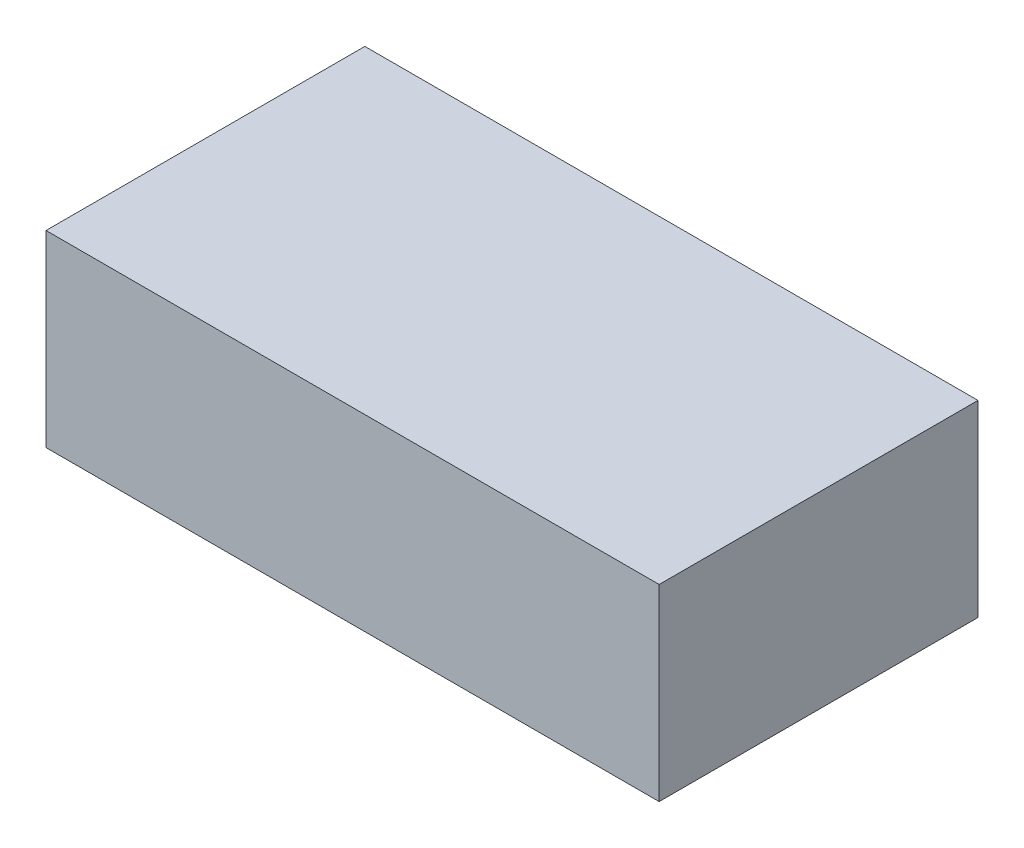
ISO-10303-21;
HEADER;
FILE_DESCRIPTION(('STEP AP214'),'2;1');
FILE_NAME('part.step','',(''),(''),'','','');
FILE_SCHEMA(('AUTOMOTIVE_DESIGN { 1 0 10303 214 1 1 1 1 }'));
ENDSEC;
DATA;
#1=APPLICATION_CONTEXT('core data for automotive mechanical design processes');
#2=APPLICATION_PROTOCOL_DEFINITION('international standard','automotive_design',2000,#1);
#3=PRODUCT_CONTEXT('',#1,'mechanical');
#4=PRODUCT('Part','Part','',(#3));
#5=PRODUCT_RELATED_PRODUCT_CATEGORY('part','',(#4));
#6=PRODUCT_DEFINITION_FORMATION('','',#4);
#7=PRODUCT_DEFINITION_CONTEXT('part definition',#1,'design');
#8=PRODUCT_DEFINITION('design','',#6,#7);
#9=PRODUCT_DEFINITION_SHAPE('','',#8);
#10=(LENGTH_UNIT() NAMED_UNIT(*) SI_UNIT(.MILLI.,.METRE.));
#11=(NAMED_UNIT(*) PLANE_ANGLE_UNIT() SI_UNIT($,.RADIAN.));
#12=(NAMED_UNIT(*) SI_UNIT($,.STERADIAN.) SOLID_ANGLE_UNIT());
#13=UNCERTAINTY_MEASURE_WITH_UNIT(LENGTH_MEASURE(1.E-05),#10,'distance_accuracy_value','');
#14=(GEOMETRIC_REPRESENTATION_CONTEXT(3) GLOBAL_UNCERTAINTY_ASSIGNED_CONTEXT((#13)) GLOBAL_UNIT_ASSIGNED_CONTEXT((#10,
#11,#12)) REPRESENTATION_CONTEXT('',''));
#15=CARTESIAN_POINT('',(0.,0.,0.));
#16=DIRECTION('',(0.,0.,1.));
#17=DIRECTION('',(1.,0.,0.));
#18=AXIS2_PLACEMENT_3D('',#15,#16,#17);
#19=CARTESIAN_POINT('',(0.,0.,39.));
#20=DIRECTION('',(1.,0.,0.));
#21=DIRECTION('',(0.,0.,-1.));
#22=AXIS2_PLACEMENT_3D('',#19,#20,#21);
#23=PLANE('',#22);
#24=DIRECTION('',(0.,-1.,0.));
#25=VECTOR('',#24,1.);
#26=CARTESIAN_POINT('',(0.,0.,0.));
#27=LINE('',#26,#25);
#28=CARTESIAN_POINT('',(0.,23.,0.));
#29=VERTEX_POINT('',#28);
#30=CARTESIAN_POINT('',(0.,0.,0.));
#31=VERTEX_POINT('',#30);
#32=EDGE_CURVE('E108',#29,#31,#27,.T.);
#33=ORIENTED_EDGE('',*,*,#32,.T.);
#34=DIRECTION('',(0.,0.,-1.));
#35=VECTOR('',#34,1.);
#36=CARTESIAN_POINT('',(0.,0.,39.));
#37=LINE('',#36,#35);
#38=CARTESIAN_POINT('',(0.,0.,39.));
#39=VERTEX_POINT('',#38);
#40=EDGE_CURVE('E11',#39,#31,#37,.T.);
#41=ORIENTED_EDGE('',*,*,#40,.F.);
#42=DIRECTION('',(0.,-1.,0.));
#43=VECTOR('',#42,1.);
#44=CARTESIAN_POINT('',(0.,0.,39.));
#45=LINE('',#44,#43);
#46=CARTESIAN_POINT('',(0.,23.,39.));
#47=VERTEX_POINT('',#46);
#48=EDGE_CURVE('E92',#47,#39,#45,.T.);
#49=ORIENTED_EDGE('',*,*,#48,.F.);
#50=DIRECTION('',(0.,0.,-1.));
#51=VECTOR('',#50,1.);
#52=CARTESIAN_POINT('',(0.,23.,39.));
#53=LINE('',#52,#51);
#54=EDGE_CURVE('E105',#47,#29,#53,.T.);
#55=ORIENTED_EDGE('',*,*,#54,.T.);
#56=EDGE_LOOP('',(#33,#41,#49,#55));
#57=FACE_BOUND('',#56,.T.);
#58=ADVANCED_FACE('F43',(#57),#23,.F.);
#59=CARTESIAN_POINT('',(0.,0.,39.));
#60=DIRECTION('',(0.,1.,0.));
#61=DIRECTION('',(0.,0.,1.));
#62=AXIS2_PLACEMENT_3D('',#59,#60,#61);
#63=PLANE('',#62);
#64=DIRECTION('',(1.,0.,0.));
#65=VECTOR('',#64,1.);
#66=CARTESIAN_POINT('',(0.,0.,0.));
#67=LINE('',#66,#65);
#68=CARTESIAN_POINT('',(75.,0.,0.));
#69=VERTEX_POINT('',#68);
#70=EDGE_CURVE('E97',#31,#69,#67,.T.);
#71=ORIENTED_EDGE('',*,*,#70,.T.);
#72=DIRECTION('',(0.,0.,-1.));
#73=VECTOR('',#72,1.);
#74=CARTESIAN_POINT('',(75.,0.,39.));
#75=LINE('',#74,#73);
#76=CARTESIAN_POINT('',(75.,0.,39.));
#77=VERTEX_POINT('',#76);
#78=EDGE_CURVE('E51',#77,#69,#75,.T.);
#79=ORIENTED_EDGE('',*,*,#78,.F.);
#80=DIRECTION('',(1.,0.,0.));
#81=VECTOR('',#80,1.);
#82=CARTESIAN_POINT('',(0.,0.,39.));
#83=LINE('',#82,#81);
#84=EDGE_CURVE('E87',#39,#77,#83,.T.);
#85=ORIENTED_EDGE('',*,*,#84,.F.);
#86=ORIENTED_EDGE('',*,*,#40,.T.);
#87=EDGE_LOOP('',(#71,#79,#85,#86));
#88=FACE_BOUND('',#87,.T.);
#89=ADVANCED_FACE('F100',(#88),#63,.F.);
#90=CARTESIAN_POINT('',(75.,0.,39.));
#91=DIRECTION('',(-1.,0.,0.));
#92=DIRECTION('',(0.,0.,1.));
#93=AXIS2_PLACEMENT_3D('',#90,#91,#92);
#94=PLANE('',#93);
#95=DIRECTION('',(0.,1.,0.));
#96=VECTOR('',#95,1.);
#97=CARTESIAN_POINT('',(75.,0.,0.));
#98=LINE('',#97,#96);
#99=CARTESIAN_POINT('',(75.,23.,0.));
#100=VERTEX_POINT('',#99);
#101=EDGE_CURVE('E78',#69,#100,#98,.T.);
#102=ORIENTED_EDGE('',*,*,#101,.T.);
#103=DIRECTION('',(0.,0.,-1.));
#104=VECTOR('',#103,1.);
#105=CARTESIAN_POINT('',(75.,23.,39.));
#106=LINE('',#105,#104);
#107=CARTESIAN_POINT('',(75.,23.,39.));
#108=VERTEX_POINT('',#107);
#109=EDGE_CURVE('E98',#108,#100,#106,.T.);
#110=ORIENTED_EDGE('',*,*,#109,.F.);
#111=DIRECTION('',(0.,1.,0.));
#112=VECTOR('',#111,1.);
#113=CARTESIAN_POINT('',(75.,0.,39.));
#114=LINE('',#113,#112);
#115=EDGE_CURVE('E95',#77,#108,#114,.T.);
#116=ORIENTED_EDGE('',*,*,#115,.F.);
#117=ORIENTED_EDGE('',*,*,#78,.T.);
#118=EDGE_LOOP('',(#102,#110,#116,#117));
#119=FACE_BOUND('',#118,.T.);
#120=ADVANCED_FACE('F99',(#119),#94,.F.);
#121=CARTESIAN_POINT('',(0.,23.,39.));
#122=DIRECTION('',(0.,-1.,0.));
#123=DIRECTION('',(0.,0.,-1.));
#124=AXIS2_PLACEMENT_3D('',#121,#122,#123);
#125=PLANE('',#124);
#126=DIRECTION('',(-1.,0.,0.));
#127=VECTOR('',#126,1.);
#128=CARTESIAN_POINT('',(0.,23.,0.));
#129=LINE('',#128,#127);
#130=EDGE_CURVE('E85',#100,#29,#129,.T.);
#131=ORIENTED_EDGE('',*,*,#130,.T.);
#132=ORIENTED_EDGE('',*,*,#54,.F.);
#133=DIRECTION('',(-1.,0.,0.));
#134=VECTOR('',#133,1.);
#135=CARTESIAN_POINT('',(0.,23.,39.));
#136=LINE('',#135,#134);
#137=EDGE_CURVE('E56',#108,#47,#136,.T.);
#138=ORIENTED_EDGE('',*,*,#137,.F.);
#139=ORIENTED_EDGE('',*,*,#109,.T.);
#140=EDGE_LOOP('',(#131,#132,#138,#139));
#141=FACE_BOUND('',#140,.T.);
#142=ADVANCED_FACE('F111',(#141),#125,.F.);
#143=CARTESIAN_POINT('',(0.,0.,39.));
#144=DIRECTION('',(0.,0.,-1.));
#145=DIRECTION('',(-1.,0.,0.));
#146=AXIS2_PLACEMENT_3D('',#143,#144,#145);
#147=PLANE('',#146);
#148=ORIENTED_EDGE('',*,*,#48,.T.);
#149=ORIENTED_EDGE('',*,*,#84,.T.);
#150=ORIENTED_EDGE('',*,*,#115,.T.);
#151=ORIENTED_EDGE('',*,*,#137,.T.);
#152=EDGE_LOOP('',(#148,#149,#150,#151));
#153=FACE_BOUND('',#152,.T.);
#154=ADVANCED_FACE('F89',(#153),#147,.F.);
#155=CARTESIAN_POINT('',(0.,0.,0.));
#156=DIRECTION('',(0.,0.,-1.));
#157=DIRECTION('',(-1.,0.,0.));
#158=AXIS2_PLACEMENT_3D('',#155,#156,#157);
#159=PLANE('',#158);
#160=ORIENTED_EDGE('',*,*,#32,.F.);
#161=ORIENTED_EDGE('',*,*,#130,.F.);
#162=ORIENTED_EDGE('',*,*,#101,.F.);
#163=ORIENTED_EDGE('',*,*,#70,.F.);
#164=EDGE_LOOP('',(#160,#161,#162,#163));
#165=FACE_BOUND('',#164,.T.);
#166=ADVANCED_FACE('F118',(#165),#159,.T.);
#167=CLOSED_SHELL('',(#58,#89,#120,#142,#154,#166));
#168=MANIFOLD_SOLID_BREP('B2',#167);
#169=ADVANCED_BREP_SHAPE_REPRESENTATION('',(#18,#168),#14);
#170=SHAPE_DEFINITION_REPRESENTATION(#9,#169);
ENDSEC;
END-ISO-10303-21;
